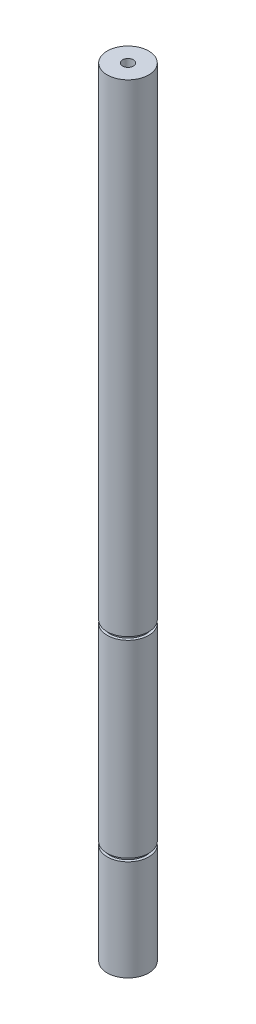
ISO-10303-21;
HEADER;
FILE_DESCRIPTION(('STEP AP214'),'2;1');
FILE_NAME('part.step','',(''),(''),'','','');
FILE_SCHEMA(('AUTOMOTIVE_DESIGN { 1 0 10303 214 1 1 1 1 }'));
ENDSEC;
DATA;
#1=APPLICATION_CONTEXT('core data for automotive mechanical design processes');
#2=APPLICATION_PROTOCOL_DEFINITION('international standard','automotive_design',2000,#1);
#3=PRODUCT_CONTEXT('',#1,'mechanical');
#4=PRODUCT('Part','Part','',(#3));
#5=PRODUCT_RELATED_PRODUCT_CATEGORY('part','',(#4));
#6=PRODUCT_DEFINITION_FORMATION('','',#4);
#7=PRODUCT_DEFINITION_CONTEXT('part definition',#1,'design');
#8=PRODUCT_DEFINITION('design','',#6,#7);
#9=PRODUCT_DEFINITION_SHAPE('','',#8);
#10=(LENGTH_UNIT() NAMED_UNIT(*) SI_UNIT(.MILLI.,.METRE.));
#11=(NAMED_UNIT(*) PLANE_ANGLE_UNIT() SI_UNIT($,.RADIAN.));
#12=(NAMED_UNIT(*) SI_UNIT($,.STERADIAN.) SOLID_ANGLE_UNIT());
#13=UNCERTAINTY_MEASURE_WITH_UNIT(LENGTH_MEASURE(1.E-05),#10,'distance_accuracy_value','');
#14=(GEOMETRIC_REPRESENTATION_CONTEXT(3) GLOBAL_UNCERTAINTY_ASSIGNED_CONTEXT((#13)) GLOBAL_UNIT_ASSIGNED_CONTEXT((#10,
#11,#12)) REPRESENTATION_CONTEXT('',''));
#15=CARTESIAN_POINT('',(0.,0.,0.));
#16=DIRECTION('',(0.,0.,1.));
#17=DIRECTION('',(1.,0.,0.));
#18=AXIS2_PLACEMENT_3D('',#15,#16,#17);
#19=CARTESIAN_POINT('',(0.,150.,0.));
#20=DIRECTION('',(0.,-1.,0.));
#21=DIRECTION('',(0.,0.,-1.));
#22=AXIS2_PLACEMENT_3D('',#19,#20,#21);
#23=CYLINDRICAL_SURFACE('',#22,8.);
#24=CARTESIAN_POINT('',(0.,-110.,0.));
#25=DIRECTION('',(0.,1.,0.));
#26=DIRECTION('',(0.,0.,1.));
#27=AXIS2_PLACEMENT_3D('',#24,#25,#26);
#28=CIRCLE('',#27,8.);
#29=CARTESIAN_POINT('',(0.,-110.,8.));
#30=VERTEX_POINT('',#29);
#31=EDGE_CURVE('E147',#30,#30,#28,.T.);
#32=ORIENTED_EDGE('',*,*,#31,.T.);
#33=EDGE_LOOP('',(#32));
#34=FACE_BOUND('',#33,.T.);
#35=CARTESIAN_POINT('',(0.,-37.2,0.));
#36=DIRECTION('',(0.,1.,0.));
#37=DIRECTION('',(0.,0.,1.));
#38=AXIS2_PLACEMENT_3D('',#35,#36,#37);
#39=CIRCLE('',#38,8.);
#40=CARTESIAN_POINT('',(0.,-37.2,8.));
#41=VERTEX_POINT('',#40);
#42=EDGE_CURVE('E143',#41,#41,#39,.T.);
#43=ORIENTED_EDGE('',*,*,#42,.F.);
#44=EDGE_LOOP('',(#43));
#45=FACE_BOUND('',#44,.T.);
#46=ADVANCED_FACE('F61',(#34,#45),#23,.T.);
#47=CARTESIAN_POINT('',(0.,-150.,0.));
#48=DIRECTION('',(0.,1.,0.));
#49=DIRECTION('',(0.,0.,1.));
#50=AXIS2_PLACEMENT_3D('',#47,#48,#49);
#51=CIRCLE('',#50,8.);
#52=CARTESIAN_POINT('',(0.,-150.,8.));
#53=VERTEX_POINT('',#52);
#54=EDGE_CURVE('E65',#53,#53,#51,.T.);
#55=ORIENTED_EDGE('',*,*,#54,.T.);
#56=EDGE_LOOP('',(#55));
#57=FACE_BOUND('',#56,.T.);
#58=CARTESIAN_POINT('',(0.,-111.2,0.));
#59=DIRECTION('',(0.,1.,0.));
#60=DIRECTION('',(0.,0.,1.));
#61=AXIS2_PLACEMENT_3D('',#58,#59,#60);
#62=CIRCLE('',#61,8.);
#63=CARTESIAN_POINT('',(0.,-111.2,8.));
#64=VERTEX_POINT('',#63);
#65=EDGE_CURVE('E92',#64,#64,#62,.T.);
#66=ORIENTED_EDGE('',*,*,#65,.F.);
#67=EDGE_LOOP('',(#66));
#68=FACE_BOUND('',#67,.T.);
#69=ADVANCED_FACE('F63',(#57,#68),#23,.T.);
#70=CARTESIAN_POINT('',(0.,-150.,0.));
#71=DIRECTION('',(0.,1.,0.));
#72=DIRECTION('',(0.,0.,1.));
#73=AXIS2_PLACEMENT_3D('',#70,#71,#72);
#74=PLANE('',#73);
#75=CARTESIAN_POINT('',(0.,-150.,0.));
#76=DIRECTION('',(0.,-1.,0.));
#77=DIRECTION('',(0.,0.,-1.));
#78=AXIS2_PLACEMENT_3D('',#75,#76,#77);
#79=CIRCLE('',#78,2.1);
#80=CARTESIAN_POINT('',(0.,-150.,-2.1));
#81=VERTEX_POINT('',#80);
#82=EDGE_CURVE('E86',#81,#81,#79,.T.);
#83=ORIENTED_EDGE('',*,*,#82,.F.);
#84=EDGE_LOOP('',(#83));
#85=FACE_BOUND('',#84,.T.);
#86=ORIENTED_EDGE('',*,*,#54,.F.);
#87=EDGE_LOOP('',(#86));
#88=FACE_BOUND('',#87,.T.);
#89=ADVANCED_FACE('F79',(#85,#88),#74,.F.);
#90=CARTESIAN_POINT('',(0.,-136.,0.));
#91=DIRECTION('',(0.,-1.,0.));
#92=DIRECTION('',(0.,0.,-1.));
#93=AXIS2_PLACEMENT_3D('',#90,#91,#92);
#94=CONICAL_SURFACE('',#93,2.1,1.02974425867666);
#95=CARTESIAN_POINT('',(0.,-134.738192700042,0.));
#96=VERTEX_POINT('',#95);
#97=VERTEX_LOOP('',#96);
#98=FACE_BOUND('',#97,.T.);
#99=CARTESIAN_POINT('',(0.,-136.,0.));
#100=DIRECTION('',(0.,-1.,0.));
#101=DIRECTION('',(0.,0.,-1.));
#102=AXIS2_PLACEMENT_3D('',#99,#100,#101);
#103=CIRCLE('',#102,2.1);
#104=CARTESIAN_POINT('',(0.,-136.,-2.1));
#105=VERTEX_POINT('',#104);
#106=EDGE_CURVE('E83',#105,#105,#103,.T.);
#107=ORIENTED_EDGE('',*,*,#106,.T.);
#108=EDGE_LOOP('',(#107));
#109=FACE_BOUND('',#108,.T.);
#110=ADVANCED_FACE('F75',(#98,#109),#94,.F.);
#111=CARTESIAN_POINT('',(0.,-150.,0.));
#112=DIRECTION('',(0.,-1.,0.));
#113=DIRECTION('',(0.,0.,-1.));
#114=AXIS2_PLACEMENT_3D('',#111,#112,#113);
#115=CYLINDRICAL_SURFACE('',#114,2.1);
#116=ORIENTED_EDGE('',*,*,#106,.F.);
#117=EDGE_LOOP('',(#116));
#118=FACE_BOUND('',#117,.T.);
#119=ORIENTED_EDGE('',*,*,#82,.T.);
#120=EDGE_LOOP('',(#119));
#121=FACE_BOUND('',#120,.T.);
#122=ADVANCED_FACE('F78',(#118,#121),#115,.F.);
#123=CARTESIAN_POINT('',(8.,-111.2,0.));
#124=DIRECTION('',(0.,1.,0.));
#125=DIRECTION('',(0.,0.,1.));
#126=AXIS2_PLACEMENT_3D('',#123,#124,#125);
#127=PLANE('',#126);
#128=ORIENTED_EDGE('',*,*,#65,.T.);
#129=EDGE_LOOP('',(#128));
#130=FACE_BOUND('',#129,.T.);
#131=CARTESIAN_POINT('',(0.,-111.2,0.));
#132=DIRECTION('',(0.,1.,0.));
#133=DIRECTION('',(0.,0.,1.));
#134=AXIS2_PLACEMENT_3D('',#131,#132,#133);
#135=CIRCLE('',#134,7.);
#136=CARTESIAN_POINT('',(0.,-111.2,7.));
#137=VERTEX_POINT('',#136);
#138=EDGE_CURVE('E154',#137,#137,#135,.T.);
#139=ORIENTED_EDGE('',*,*,#138,.F.);
#140=EDGE_LOOP('',(#139));
#141=FACE_BOUND('',#140,.T.);
#142=ADVANCED_FACE('F161',(#130,#141),#127,.T.);
#143=CARTESIAN_POINT('',(0.,150.,0.));
#144=DIRECTION('',(0.,1.,0.));
#145=DIRECTION('',(0.,0.,1.));
#146=AXIS2_PLACEMENT_3D('',#143,#144,#145);
#147=CYLINDRICAL_SURFACE('',#146,7.);
#148=ORIENTED_EDGE('',*,*,#138,.T.);
#149=EDGE_LOOP('',(#148));
#150=FACE_BOUND('',#149,.T.);
#151=CARTESIAN_POINT('',(0.,-110.,0.));
#152=DIRECTION('',(0.,1.,0.));
#153=DIRECTION('',(0.,0.,1.));
#154=AXIS2_PLACEMENT_3D('',#151,#152,#153);
#155=CIRCLE('',#154,7.);
#156=CARTESIAN_POINT('',(0.,-110.,7.));
#157=VERTEX_POINT('',#156);
#158=EDGE_CURVE('E150',#157,#157,#155,.T.);
#159=ORIENTED_EDGE('',*,*,#158,.F.);
#160=EDGE_LOOP('',(#159));
#161=FACE_BOUND('',#160,.T.);
#162=ADVANCED_FACE('F164',(#150,#161),#147,.T.);
#163=CARTESIAN_POINT('',(8.,-110.,0.));
#164=DIRECTION('',(0.,-1.,0.));
#165=DIRECTION('',(0.,0.,-1.));
#166=AXIS2_PLACEMENT_3D('',#163,#164,#165);
#167=PLANE('',#166);
#168=ORIENTED_EDGE('',*,*,#158,.T.);
#169=EDGE_LOOP('',(#168));
#170=FACE_BOUND('',#169,.T.);
#171=ORIENTED_EDGE('',*,*,#31,.F.);
#172=EDGE_LOOP('',(#171));
#173=FACE_BOUND('',#172,.T.);
#174=ADVANCED_FACE('F170',(#170,#173),#167,.T.);
#175=CARTESIAN_POINT('',(8.,-37.2,0.));
#176=DIRECTION('',(0.,1.,0.));
#177=DIRECTION('',(0.,0.,1.));
#178=AXIS2_PLACEMENT_3D('',#175,#176,#177);
#179=PLANE('',#178);
#180=ORIENTED_EDGE('',*,*,#42,.T.);
#181=EDGE_LOOP('',(#180));
#182=FACE_BOUND('',#181,.T.);
#183=CARTESIAN_POINT('',(0.,-37.2,0.));
#184=DIRECTION('',(0.,1.,0.));
#185=DIRECTION('',(0.,0.,1.));
#186=AXIS2_PLACEMENT_3D('',#183,#184,#185);
#187=CIRCLE('',#186,7.);
#188=CARTESIAN_POINT('',(0.,-37.2,7.));
#189=VERTEX_POINT('',#188);
#190=EDGE_CURVE('E138',#189,#189,#187,.T.);
#191=ORIENTED_EDGE('',*,*,#190,.F.);
#192=EDGE_LOOP('',(#191));
#193=FACE_BOUND('',#192,.T.);
#194=ADVANCED_FACE('F176',(#182,#193),#179,.T.);
#195=CARTESIAN_POINT('',(0.,224.,0.));
#196=DIRECTION('',(0.,1.,0.));
#197=DIRECTION('',(0.,0.,1.));
#198=AXIS2_PLACEMENT_3D('',#195,#196,#197);
#199=CYLINDRICAL_SURFACE('',#198,7.);
#200=ORIENTED_EDGE('',*,*,#190,.T.);
#201=EDGE_LOOP('',(#200));
#202=FACE_BOUND('',#201,.T.);
#203=CARTESIAN_POINT('',(0.,-36.,0.));
#204=DIRECTION('',(0.,1.,0.));
#205=DIRECTION('',(0.,0.,1.));
#206=AXIS2_PLACEMENT_3D('',#203,#204,#205);
#207=CIRCLE('',#206,7.);
#208=CARTESIAN_POINT('',(0.,-36.,7.));
#209=VERTEX_POINT('',#208);
#210=EDGE_CURVE('E133',#209,#209,#207,.T.);
#211=ORIENTED_EDGE('',*,*,#210,.F.);
#212=EDGE_LOOP('',(#211));
#213=FACE_BOUND('',#212,.T.);
#214=ADVANCED_FACE('F182',(#202,#213),#199,.T.);
#215=CARTESIAN_POINT('',(8.,-36.,0.));
#216=DIRECTION('',(0.,-1.,0.));
#217=DIRECTION('',(0.,0.,-1.));
#218=AXIS2_PLACEMENT_3D('',#215,#216,#217);
#219=PLANE('',#218);
#220=ORIENTED_EDGE('',*,*,#210,.T.);
#221=EDGE_LOOP('',(#220));
#222=FACE_BOUND('',#221,.T.);
#223=CARTESIAN_POINT('',(0.,-36.,0.));
#224=DIRECTION('',(0.,1.,0.));
#225=DIRECTION('',(0.,0.,1.));
#226=AXIS2_PLACEMENT_3D('',#223,#224,#225);
#227=CIRCLE('',#226,8.);
#228=CARTESIAN_POINT('',(0.,-36.,8.));
#229=VERTEX_POINT('',#228);
#230=EDGE_CURVE('E130',#229,#229,#227,.T.);
#231=ORIENTED_EDGE('',*,*,#230,.F.);
#232=EDGE_LOOP('',(#231));
#233=FACE_BOUND('',#232,.T.);
#234=ADVANCED_FACE('F194',(#222,#233),#219,.T.);
#235=CARTESIAN_POINT('',(0.,136.,0.));
#236=DIRECTION('',(0.,1.,0.));
#237=DIRECTION('',(0.,0.,1.));
#238=AXIS2_PLACEMENT_3D('',#235,#236,#237);
#239=CONICAL_SURFACE('',#238,2.1,1.02974425867666);
#240=CARTESIAN_POINT('',(0.,134.738192700042,0.));
#241=VERTEX_POINT('',#240);
#242=VERTEX_LOOP('',#241);
#243=FACE_BOUND('',#242,.T.);
#244=CARTESIAN_POINT('',(0.,136.,0.));
#245=DIRECTION('',(0.,1.,0.));
#246=DIRECTION('',(0.,0.,1.));
#247=AXIS2_PLACEMENT_3D('',#244,#245,#246);
#248=CIRCLE('',#247,2.1);
#249=CARTESIAN_POINT('',(0.,136.,2.1));
#250=VERTEX_POINT('',#249);
#251=EDGE_CURVE('E89',#250,#250,#248,.T.);
#252=ORIENTED_EDGE('',*,*,#251,.T.);
#253=EDGE_LOOP('',(#252));
#254=FACE_BOUND('',#253,.T.);
#255=ADVANCED_FACE('F191',(#243,#254),#239,.F.);
#256=CARTESIAN_POINT('',(0.,150.,0.));
#257=DIRECTION('',(0.,1.,0.));
#258=DIRECTION('',(0.,0.,1.));
#259=AXIS2_PLACEMENT_3D('',#256,#257,#258);
#260=CYLINDRICAL_SURFACE('',#259,2.1);
#261=ORIENTED_EDGE('',*,*,#251,.F.);
#262=EDGE_LOOP('',(#261));
#263=FACE_BOUND('',#262,.T.);
#264=CARTESIAN_POINT('',(0.,150.,0.));
#265=DIRECTION('',(0.,1.,0.));
#266=DIRECTION('',(0.,0.,1.));
#267=AXIS2_PLACEMENT_3D('',#264,#265,#266);
#268=CIRCLE('',#267,2.1);
#269=CARTESIAN_POINT('',(0.,150.,2.1));
#270=VERTEX_POINT('',#269);
#271=EDGE_CURVE('E85',#270,#270,#268,.T.);
#272=ORIENTED_EDGE('',*,*,#271,.T.);
#273=EDGE_LOOP('',(#272));
#274=FACE_BOUND('',#273,.T.);
#275=ADVANCED_FACE('F124',(#263,#274),#260,.F.);
#276=CARTESIAN_POINT('',(0.,150.,0.));
#277=DIRECTION('',(0.,1.,0.));
#278=DIRECTION('',(0.,0.,1.));
#279=AXIS2_PLACEMENT_3D('',#276,#277,#278);
#280=PLANE('',#279);
#281=ORIENTED_EDGE('',*,*,#271,.F.);
#282=EDGE_LOOP('',(#281));
#283=FACE_BOUND('',#282,.T.);
#284=CARTESIAN_POINT('',(0.,150.,0.));
#285=DIRECTION('',(0.,1.,0.));
#286=DIRECTION('',(0.,0.,1.));
#287=AXIS2_PLACEMENT_3D('',#284,#285,#286);
#288=CIRCLE('',#287,8.);
#289=CARTESIAN_POINT('',(0.,150.,8.));
#290=VERTEX_POINT('',#289);
#291=EDGE_CURVE('E13',#290,#290,#288,.T.);
#292=ORIENTED_EDGE('',*,*,#291,.T.);
#293=EDGE_LOOP('',(#292));
#294=FACE_BOUND('',#293,.T.);
#295=ADVANCED_FACE('F119',(#283,#294),#280,.T.);
#296=ORIENTED_EDGE('',*,*,#291,.F.);
#297=EDGE_LOOP('',(#296));
#298=FACE_BOUND('',#297,.T.);
#299=ORIENTED_EDGE('',*,*,#230,.T.);
#300=EDGE_LOOP('',(#299));
#301=FACE_BOUND('',#300,.T.);
#302=ADVANCED_FACE('F109',(#298,#301),#23,.T.);
#303=CLOSED_SHELL('',(#46,#69,#89,#110,#122,#142,#162,#174,#194,#214,#234,#255,#275,#295,#302));
#304=MANIFOLD_SOLID_BREP('B2',#303);
#305=ADVANCED_BREP_SHAPE_REPRESENTATION('',(#18,#304),#14);
#306=SHAPE_DEFINITION_REPRESENTATION(#9,#305);
ENDSEC;
END-ISO-10303-21;
